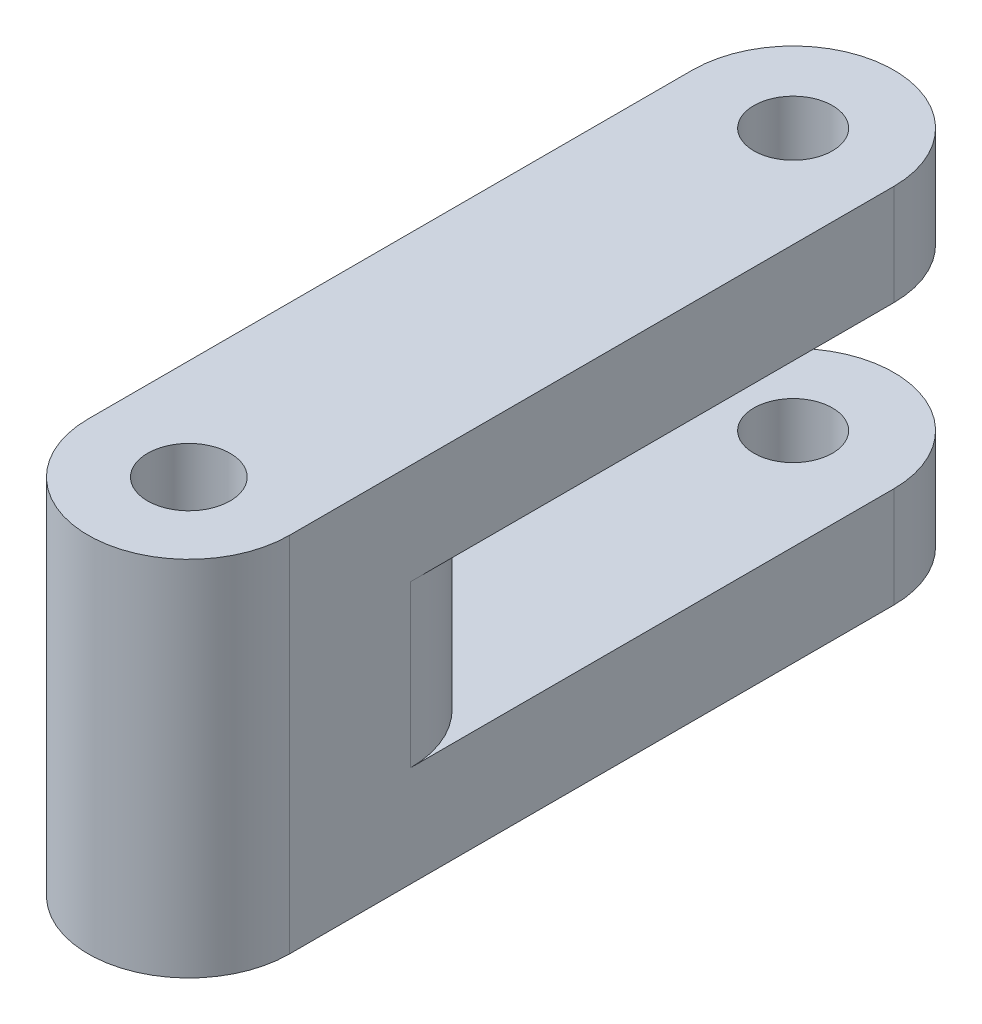
ISO-10303-21;
HEADER;
FILE_DESCRIPTION(('STEP AP214'),'2;1');
FILE_NAME('part.step','',(''),(''),'','','');
FILE_SCHEMA(('AUTOMOTIVE_DESIGN { 1 0 10303 214 1 1 1 1 }'));
ENDSEC;
DATA;
#1=APPLICATION_CONTEXT('core data for automotive mechanical design processes');
#2=APPLICATION_PROTOCOL_DEFINITION('international standard','automotive_design',2000,#1);
#3=PRODUCT_CONTEXT('',#1,'mechanical');
#4=PRODUCT('Part','Part','',(#3));
#5=PRODUCT_RELATED_PRODUCT_CATEGORY('part','',(#4));
#6=PRODUCT_DEFINITION_FORMATION('','',#4);
#7=PRODUCT_DEFINITION_CONTEXT('part definition',#1,'design');
#8=PRODUCT_DEFINITION('design','',#6,#7);
#9=PRODUCT_DEFINITION_SHAPE('','',#8);
#10=(LENGTH_UNIT() NAMED_UNIT(*) SI_UNIT(.MILLI.,.METRE.));
#11=(NAMED_UNIT(*) PLANE_ANGLE_UNIT() SI_UNIT($,.RADIAN.));
#12=(NAMED_UNIT(*) SI_UNIT($,.STERADIAN.) SOLID_ANGLE_UNIT());
#13=UNCERTAINTY_MEASURE_WITH_UNIT(LENGTH_MEASURE(1.E-05),#10,'distance_accuracy_value','');
#14=(GEOMETRIC_REPRESENTATION_CONTEXT(3) GLOBAL_UNCERTAINTY_ASSIGNED_CONTEXT((#13)) GLOBAL_UNIT_ASSIGNED_CONTEXT((#10,
#11,#12)) REPRESENTATION_CONTEXT('',''));
#15=CARTESIAN_POINT('',(0.,0.,0.));
#16=DIRECTION('',(0.,0.,1.));
#17=DIRECTION('',(1.,0.,0.));
#18=AXIS2_PLACEMENT_3D('',#15,#16,#17);
#19=CARTESIAN_POINT('',(0.,5.,0.));
#20=DIRECTION('',(0.,1.,0.));
#21=DIRECTION('',(0.,0.,1.));
#22=AXIS2_PLACEMENT_3D('',#19,#20,#21);
#23=PLANE('',#22);
#24=CARTESIAN_POINT('',(0.,5.,-6.));
#25=DIRECTION('',(0.,1.,0.));
#26=DIRECTION('',(0.,0.,1.));
#27=AXIS2_PLACEMENT_3D('',#24,#25,#26);
#28=CIRCLE('',#27,5.);
#29=CARTESIAN_POINT('',(5.,5.,-6.));
#30=VERTEX_POINT('',#29);
#31=CARTESIAN_POINT('',(-5.,5.,-6.));
#32=VERTEX_POINT('',#31);
#33=EDGE_CURVE('E78',#30,#32,#28,.T.);
#34=ORIENTED_EDGE('',*,*,#33,.F.);
#35=DIRECTION('',(0.,0.,-1.));
#36=VECTOR('',#35,1.);
#37=CARTESIAN_POINT('',(5.,5.,0.));
#38=LINE('',#37,#36);
#39=CARTESIAN_POINT('',(5.,5.,-30.));
#40=VERTEX_POINT('',#39);
#41=EDGE_CURVE('E116',#30,#40,#38,.T.);
#42=ORIENTED_EDGE('',*,*,#41,.T.);
#43=CARTESIAN_POINT('',(0.,5.,-30.));
#44=DIRECTION('',(0.,1.,0.));
#45=DIRECTION('',(0.,0.,1.));
#46=AXIS2_PLACEMENT_3D('',#43,#44,#45);
#47=CIRCLE('',#46,5.);
#48=CARTESIAN_POINT('',(-5.,5.,-30.));
#49=VERTEX_POINT('',#48);
#50=EDGE_CURVE('E84',#40,#49,#47,.T.);
#51=ORIENTED_EDGE('',*,*,#50,.T.);
#52=DIRECTION('',(0.,0.,1.));
#53=VECTOR('',#52,1.);
#54=CARTESIAN_POINT('',(-5.,5.,0.));
#55=LINE('',#54,#53);
#56=EDGE_CURVE('E126',#49,#32,#55,.T.);
#57=ORIENTED_EDGE('',*,*,#56,.T.);
#58=EDGE_LOOP('',(#34,#42,#51,#57));
#59=FACE_BOUND('',#58,.T.);
#60=CARTESIAN_POINT('',(0.,5.,-30.));
#61=DIRECTION('',(0.,1.,0.));
#62=DIRECTION('',(0.,0.,1.));
#63=AXIS2_PLACEMENT_3D('',#60,#61,#62);
#64=CIRCLE('',#63,1.95);
#65=CARTESIAN_POINT('',(0.,5.,-28.05));
#66=VERTEX_POINT('',#65);
#67=EDGE_CURVE('E131',#66,#66,#64,.T.);
#68=ORIENTED_EDGE('',*,*,#67,.F.);
#69=EDGE_LOOP('',(#68));
#70=FACE_BOUND('',#69,.T.);
#71=ADVANCED_FACE('F63',(#59,#70),#23,.T.);
#72=CARTESIAN_POINT('',(0.,0.,0.));
#73=DIRECTION('',(0.,1.,0.));
#74=DIRECTION('',(0.,0.,1.));
#75=AXIS2_PLACEMENT_3D('',#72,#73,#74);
#76=PLANE('',#75);
#77=CARTESIAN_POINT('',(0.,0.,0.));
#78=DIRECTION('',(0.,1.,0.));
#79=DIRECTION('',(0.,0.,1.));
#80=AXIS2_PLACEMENT_3D('',#77,#78,#79);
#81=CIRCLE('',#80,5.);
#82=CARTESIAN_POINT('',(-5.,0.,0.));
#83=VERTEX_POINT('',#82);
#84=CARTESIAN_POINT('',(5.,0.,0.));
#85=VERTEX_POINT('',#84);
#86=EDGE_CURVE('E122',#83,#85,#81,.T.);
#87=ORIENTED_EDGE('',*,*,#86,.F.);
#88=DIRECTION('',(0.,0.,1.));
#89=VECTOR('',#88,1.);
#90=CARTESIAN_POINT('',(-5.,0.,0.));
#91=LINE('',#90,#89);
#92=CARTESIAN_POINT('',(-5.,0.,-30.));
#93=VERTEX_POINT('',#92);
#94=EDGE_CURVE('E104',#93,#83,#91,.T.);
#95=ORIENTED_EDGE('',*,*,#94,.F.);
#96=CARTESIAN_POINT('',(0.,0.,-30.));
#97=DIRECTION('',(0.,1.,0.));
#98=DIRECTION('',(0.,0.,1.));
#99=AXIS2_PLACEMENT_3D('',#96,#97,#98);
#100=CIRCLE('',#99,5.);
#101=CARTESIAN_POINT('',(5.,0.,-30.));
#102=VERTEX_POINT('',#101);
#103=EDGE_CURVE('E117',#102,#93,#100,.T.);
#104=ORIENTED_EDGE('',*,*,#103,.F.);
#105=DIRECTION('',(0.,0.,-1.));
#106=VECTOR('',#105,1.);
#107=CARTESIAN_POINT('',(5.,0.,0.));
#108=LINE('',#107,#106);
#109=EDGE_CURVE('E130',#85,#102,#108,.T.);
#110=ORIENTED_EDGE('',*,*,#109,.F.);
#111=EDGE_LOOP('',(#87,#95,#104,#110));
#112=FACE_BOUND('',#111,.T.);
#113=CARTESIAN_POINT('',(0.,0.,-30.));
#114=DIRECTION('',(0.,1.,0.));
#115=DIRECTION('',(0.,0.,1.));
#116=AXIS2_PLACEMENT_3D('',#113,#114,#115);
#117=CIRCLE('',#116,1.95);
#118=CARTESIAN_POINT('',(0.,0.,-28.05));
#119=VERTEX_POINT('',#118);
#120=EDGE_CURVE('E135',#119,#119,#117,.T.);
#121=ORIENTED_EDGE('',*,*,#120,.T.);
#122=EDGE_LOOP('',(#121));
#123=FACE_BOUND('',#122,.T.);
#124=CARTESIAN_POINT('',(0.,0.,0.));
#125=DIRECTION('',(0.,1.,0.));
#126=DIRECTION('',(0.,0.,1.));
#127=AXIS2_PLACEMENT_3D('',#124,#125,#126);
#128=CIRCLE('',#127,2.05);
#129=CARTESIAN_POINT('',(0.,0.,2.05));
#130=VERTEX_POINT('',#129);
#131=EDGE_CURVE('E192',#130,#130,#128,.T.);
#132=ORIENTED_EDGE('',*,*,#131,.T.);
#133=EDGE_LOOP('',(#132));
#134=FACE_BOUND('',#133,.T.);
#135=ADVANCED_FACE('F128',(#112,#123,#134),#76,.F.);
#136=CARTESIAN_POINT('',(0.,5.,0.));
#137=DIRECTION('',(0.,-1.,0.));
#138=DIRECTION('',(0.,0.,-1.));
#139=AXIS2_PLACEMENT_3D('',#136,#137,#138);
#140=CYLINDRICAL_SURFACE('',#139,5.);
#141=ORIENTED_EDGE('',*,*,#86,.T.);
#142=DIRECTION('',(0.,-1.,0.));
#143=VECTOR('',#142,1.);
#144=CARTESIAN_POINT('',(5.,5.,0.));
#145=LINE('',#144,#143);
#146=CARTESIAN_POINT('',(5.,18.,0.));
#147=VERTEX_POINT('',#146);
#148=EDGE_CURVE('E12',#147,#85,#145,.T.);
#149=ORIENTED_EDGE('',*,*,#148,.F.);
#150=CARTESIAN_POINT('',(0.,18.,0.));
#151=DIRECTION('',(0.,1.,0.));
#152=DIRECTION('',(0.,0.,1.));
#153=AXIS2_PLACEMENT_3D('',#150,#151,#152);
#154=CIRCLE('',#153,5.);
#155=CARTESIAN_POINT('',(-5.,18.,0.));
#156=VERTEX_POINT('',#155);
#157=EDGE_CURVE('E124',#156,#147,#154,.T.);
#158=ORIENTED_EDGE('',*,*,#157,.F.);
#159=DIRECTION('',(0.,-1.,0.));
#160=VECTOR('',#159,1.);
#161=CARTESIAN_POINT('',(-5.,5.,0.));
#162=LINE('',#161,#160);
#163=EDGE_CURVE('E109',#156,#83,#162,.T.);
#164=ORIENTED_EDGE('',*,*,#163,.T.);
#165=EDGE_LOOP('',(#141,#149,#158,#164));
#166=FACE_BOUND('',#165,.T.);
#167=ADVANCED_FACE('F65',(#166),#140,.T.);
#168=CARTESIAN_POINT('',(5.,5.,0.));
#169=DIRECTION('',(-1.,0.,0.));
#170=DIRECTION('',(0.,0.,1.));
#171=AXIS2_PLACEMENT_3D('',#168,#169,#170);
#172=PLANE('',#171);
#173=ORIENTED_EDGE('',*,*,#109,.T.);
#174=DIRECTION('',(0.,-1.,0.));
#175=VECTOR('',#174,1.);
#176=CARTESIAN_POINT('',(5.,5.,-30.));
#177=LINE('',#176,#175);
#178=EDGE_CURVE('E71',#40,#102,#177,.T.);
#179=ORIENTED_EDGE('',*,*,#178,.F.);
#180=ORIENTED_EDGE('',*,*,#41,.F.);
#181=DIRECTION('',(0.,-1.,0.));
#182=VECTOR('',#181,1.);
#183=CARTESIAN_POINT('',(5.,13.,-6.));
#184=LINE('',#183,#182);
#185=CARTESIAN_POINT('',(5.,13.,-6.));
#186=VERTEX_POINT('',#185);
#187=EDGE_CURVE('E190',#186,#30,#184,.T.);
#188=ORIENTED_EDGE('',*,*,#187,.F.);
#189=DIRECTION('',(0.,0.,1.));
#190=VECTOR('',#189,1.);
#191=CARTESIAN_POINT('',(5.,13.,0.));
#192=LINE('',#191,#190);
#193=CARTESIAN_POINT('',(5.,13.,-30.));
#194=VERTEX_POINT('',#193);
#195=EDGE_CURVE('E175',#194,#186,#192,.T.);
#196=ORIENTED_EDGE('',*,*,#195,.F.);
#197=DIRECTION('',(0.,-1.,0.));
#198=VECTOR('',#197,1.);
#199=CARTESIAN_POINT('',(5.,18.,-30.));
#200=LINE('',#199,#198);
#201=CARTESIAN_POINT('',(5.,18.,-30.));
#202=VERTEX_POINT('',#201);
#203=EDGE_CURVE('E162',#202,#194,#200,.T.);
#204=ORIENTED_EDGE('',*,*,#203,.F.);
#205=DIRECTION('',(0.,0.,1.));
#206=VECTOR('',#205,1.);
#207=CARTESIAN_POINT('',(5.,18.,0.));
#208=LINE('',#207,#206);
#209=EDGE_CURVE('E153',#202,#147,#208,.T.);
#210=ORIENTED_EDGE('',*,*,#209,.T.);
#211=ORIENTED_EDGE('',*,*,#148,.T.);
#212=EDGE_LOOP('',(#173,#179,#180,#188,#196,#204,#210,#211));
#213=FACE_BOUND('',#212,.T.);
#214=ADVANCED_FACE('F146',(#213),#172,.F.);
#215=CARTESIAN_POINT('',(0.,5.,-30.));
#216=DIRECTION('',(0.,-1.,0.));
#217=DIRECTION('',(0.,0.,-1.));
#218=AXIS2_PLACEMENT_3D('',#215,#216,#217);
#219=CYLINDRICAL_SURFACE('',#218,5.);
#220=ORIENTED_EDGE('',*,*,#103,.T.);
#221=DIRECTION('',(0.,-1.,0.));
#222=VECTOR('',#221,1.);
#223=CARTESIAN_POINT('',(-5.,5.,-30.));
#224=LINE('',#223,#222);
#225=EDGE_CURVE('E112',#49,#93,#224,.T.);
#226=ORIENTED_EDGE('',*,*,#225,.F.);
#227=ORIENTED_EDGE('',*,*,#50,.F.);
#228=ORIENTED_EDGE('',*,*,#178,.T.);
#229=EDGE_LOOP('',(#220,#226,#227,#228));
#230=FACE_BOUND('',#229,.T.);
#231=ADVANCED_FACE('F144',(#230),#219,.T.);
#232=CARTESIAN_POINT('',(-5.,5.,0.));
#233=DIRECTION('',(1.,0.,0.));
#234=DIRECTION('',(0.,0.,-1.));
#235=AXIS2_PLACEMENT_3D('',#232,#233,#234);
#236=PLANE('',#235);
#237=ORIENTED_EDGE('',*,*,#94,.T.);
#238=ORIENTED_EDGE('',*,*,#163,.F.);
#239=DIRECTION('',(0.,0.,-1.));
#240=VECTOR('',#239,1.);
#241=CARTESIAN_POINT('',(-5.,18.,0.));
#242=LINE('',#241,#240);
#243=CARTESIAN_POINT('',(-5.,18.,-30.));
#244=VERTEX_POINT('',#243);
#245=EDGE_CURVE('E160',#156,#244,#242,.T.);
#246=ORIENTED_EDGE('',*,*,#245,.T.);
#247=DIRECTION('',(0.,-1.,0.));
#248=VECTOR('',#247,1.);
#249=CARTESIAN_POINT('',(-5.,18.,-30.));
#250=LINE('',#249,#248);
#251=CARTESIAN_POINT('',(-5.,13.,-30.));
#252=VERTEX_POINT('',#251);
#253=EDGE_CURVE('E180',#244,#252,#250,.T.);
#254=ORIENTED_EDGE('',*,*,#253,.T.);
#255=DIRECTION('',(0.,0.,-1.));
#256=VECTOR('',#255,1.);
#257=CARTESIAN_POINT('',(-5.,13.,0.));
#258=LINE('',#257,#256);
#259=CARTESIAN_POINT('',(-5.,13.,-6.));
#260=VERTEX_POINT('',#259);
#261=EDGE_CURVE('E171',#260,#252,#258,.T.);
#262=ORIENTED_EDGE('',*,*,#261,.F.);
#263=DIRECTION('',(0.,-1.,0.));
#264=VECTOR('',#263,1.);
#265=CARTESIAN_POINT('',(-5.,13.,-6.));
#266=LINE('',#265,#264);
#267=EDGE_CURVE('E186',#260,#32,#266,.T.);
#268=ORIENTED_EDGE('',*,*,#267,.T.);
#269=ORIENTED_EDGE('',*,*,#56,.F.);
#270=ORIENTED_EDGE('',*,*,#225,.T.);
#271=EDGE_LOOP('',(#237,#238,#246,#254,#262,#268,#269,#270));
#272=FACE_BOUND('',#271,.T.);
#273=ADVANCED_FACE('F106',(#272),#236,.F.);
#274=CARTESIAN_POINT('',(0.,5.,-30.));
#275=DIRECTION('',(0.,-1.,0.));
#276=DIRECTION('',(0.,0.,-1.));
#277=AXIS2_PLACEMENT_3D('',#274,#275,#276);
#278=CYLINDRICAL_SURFACE('',#277,1.95);
#279=ORIENTED_EDGE('',*,*,#67,.T.);
#280=EDGE_LOOP('',(#279));
#281=FACE_BOUND('',#280,.T.);
#282=ORIENTED_EDGE('',*,*,#120,.F.);
#283=EDGE_LOOP('',(#282));
#284=FACE_BOUND('',#283,.T.);
#285=ADVANCED_FACE('F253',(#281,#284),#278,.F.);
#286=CARTESIAN_POINT('',(0.,5.,0.));
#287=DIRECTION('',(0.,-1.,0.));
#288=DIRECTION('',(0.,0.,-1.));
#289=AXIS2_PLACEMENT_3D('',#286,#287,#288);
#290=CYLINDRICAL_SURFACE('',#289,2.05);
#291=ORIENTED_EDGE('',*,*,#131,.F.);
#292=EDGE_LOOP('',(#291));
#293=FACE_BOUND('',#292,.T.);
#294=CARTESIAN_POINT('',(0.,18.,0.));
#295=DIRECTION('',(0.,1.,0.));
#296=DIRECTION('',(0.,0.,1.));
#297=AXIS2_PLACEMENT_3D('',#294,#295,#296);
#298=CIRCLE('',#297,2.05);
#299=CARTESIAN_POINT('',(0.,18.,2.05));
#300=VERTEX_POINT('',#299);
#301=EDGE_CURVE('E172',#300,#300,#298,.T.);
#302=ORIENTED_EDGE('',*,*,#301,.T.);
#303=EDGE_LOOP('',(#302));
#304=FACE_BOUND('',#303,.T.);
#305=ADVANCED_FACE('F242',(#293,#304),#290,.F.);
#306=CARTESIAN_POINT('',(0.,13.,-6.));
#307=DIRECTION('',(0.,-1.,0.));
#308=DIRECTION('',(0.,0.,-1.));
#309=AXIS2_PLACEMENT_3D('',#306,#307,#308);
#310=CYLINDRICAL_SURFACE('',#309,5.);
#311=ORIENTED_EDGE('',*,*,#33,.T.);
#312=ORIENTED_EDGE('',*,*,#267,.F.);
#313=CARTESIAN_POINT('',(0.,13.,-6.));
#314=DIRECTION('',(0.,1.,0.));
#315=DIRECTION('',(0.,0.,1.));
#316=AXIS2_PLACEMENT_3D('',#313,#314,#315);
#317=CIRCLE('',#316,5.);
#318=EDGE_CURVE('E183',#186,#260,#317,.T.);
#319=ORIENTED_EDGE('',*,*,#318,.F.);
#320=ORIENTED_EDGE('',*,*,#187,.T.);
#321=EDGE_LOOP('',(#311,#312,#319,#320));
#322=FACE_BOUND('',#321,.T.);
#323=ADVANCED_FACE('F202',(#322),#310,.T.);
#324=CARTESIAN_POINT('',(0.,18.,-30.));
#325=DIRECTION('',(0.,1.,0.));
#326=DIRECTION('',(0.,0.,1.));
#327=AXIS2_PLACEMENT_3D('',#324,#325,#326);
#328=PLANE('',#327);
#329=ORIENTED_EDGE('',*,*,#301,.F.);
#330=EDGE_LOOP('',(#329));
#331=FACE_BOUND('',#330,.T.);
#332=CARTESIAN_POINT('',(0.,18.,-30.));
#333=DIRECTION('',(0.,1.,0.));
#334=DIRECTION('',(0.,0.,1.));
#335=AXIS2_PLACEMENT_3D('',#332,#333,#334);
#336=CIRCLE('',#335,5.);
#337=EDGE_CURVE('E164',#202,#244,#336,.T.);
#338=ORIENTED_EDGE('',*,*,#337,.T.);
#339=ORIENTED_EDGE('',*,*,#245,.F.);
#340=ORIENTED_EDGE('',*,*,#157,.T.);
#341=ORIENTED_EDGE('',*,*,#209,.F.);
#342=EDGE_LOOP('',(#338,#339,#340,#341));
#343=FACE_BOUND('',#342,.T.);
#344=CARTESIAN_POINT('',(0.,18.,-30.));
#345=DIRECTION('',(0.,1.,0.));
#346=DIRECTION('',(0.,0.,1.));
#347=AXIS2_PLACEMENT_3D('',#344,#345,#346);
#348=CIRCLE('',#347,1.95);
#349=CARTESIAN_POINT('',(0.,18.,-28.05));
#350=VERTEX_POINT('',#349);
#351=EDGE_CURVE('E225',#350,#350,#348,.T.);
#352=ORIENTED_EDGE('',*,*,#351,.F.);
#353=EDGE_LOOP('',(#352));
#354=FACE_BOUND('',#353,.T.);
#355=ADVANCED_FACE('F158',(#331,#343,#354),#328,.T.);
#356=CARTESIAN_POINT('',(0.,13.,-30.));
#357=DIRECTION('',(0.,1.,0.));
#358=DIRECTION('',(0.,0.,1.));
#359=AXIS2_PLACEMENT_3D('',#356,#357,#358);
#360=PLANE('',#359);
#361=ORIENTED_EDGE('',*,*,#195,.T.);
#362=ORIENTED_EDGE('',*,*,#318,.T.);
#363=ORIENTED_EDGE('',*,*,#261,.T.);
#364=CARTESIAN_POINT('',(0.,13.,-30.));
#365=DIRECTION('',(0.,1.,0.));
#366=DIRECTION('',(0.,0.,1.));
#367=AXIS2_PLACEMENT_3D('',#364,#365,#366);
#368=CIRCLE('',#367,5.);
#369=EDGE_CURVE('E168',#194,#252,#368,.T.);
#370=ORIENTED_EDGE('',*,*,#369,.F.);
#371=EDGE_LOOP('',(#361,#362,#363,#370));
#372=FACE_BOUND('',#371,.T.);
#373=CARTESIAN_POINT('',(0.,13.,-30.));
#374=DIRECTION('',(0.,1.,0.));
#375=DIRECTION('',(0.,0.,1.));
#376=AXIS2_PLACEMENT_3D('',#373,#374,#375);
#377=CIRCLE('',#376,1.95);
#378=CARTESIAN_POINT('',(0.,13.,-28.05));
#379=VERTEX_POINT('',#378);
#380=EDGE_CURVE('E226',#379,#379,#377,.T.);
#381=ORIENTED_EDGE('',*,*,#380,.T.);
#382=EDGE_LOOP('',(#381));
#383=FACE_BOUND('',#382,.T.);
#384=ADVANCED_FACE('F210',(#372,#383),#360,.F.);
#385=CARTESIAN_POINT('',(0.,18.,-30.));
#386=DIRECTION('',(0.,-1.,0.));
#387=DIRECTION('',(0.,0.,-1.));
#388=AXIS2_PLACEMENT_3D('',#385,#386,#387);
#389=CYLINDRICAL_SURFACE('',#388,5.);
#390=ORIENTED_EDGE('',*,*,#369,.T.);
#391=ORIENTED_EDGE('',*,*,#253,.F.);
#392=ORIENTED_EDGE('',*,*,#337,.F.);
#393=ORIENTED_EDGE('',*,*,#203,.T.);
#394=EDGE_LOOP('',(#390,#391,#392,#393));
#395=FACE_BOUND('',#394,.T.);
#396=ADVANCED_FACE('F221',(#395),#389,.T.);
#397=CARTESIAN_POINT('',(0.,18.,-30.));
#398=DIRECTION('',(0.,-1.,0.));
#399=DIRECTION('',(0.,0.,-1.));
#400=AXIS2_PLACEMENT_3D('',#397,#398,#399);
#401=CYLINDRICAL_SURFACE('',#400,1.95);
#402=ORIENTED_EDGE('',*,*,#351,.T.);
#403=EDGE_LOOP('',(#402));
#404=FACE_BOUND('',#403,.T.);
#405=ORIENTED_EDGE('',*,*,#380,.F.);
#406=EDGE_LOOP('',(#405));
#407=FACE_BOUND('',#406,.T.);
#408=ADVANCED_FACE('F232',(#404,#407),#401,.F.);
#409=CLOSED_SHELL('',(#71,#135,#167,#214,#231,#273,#285,#305,#323,#355,#384,#396,#408));
#410=MANIFOLD_SOLID_BREP('B2',#409);
#411=ADVANCED_BREP_SHAPE_REPRESENTATION('',(#18,#410),#14);
#412=SHAPE_DEFINITION_REPRESENTATION(#9,#411);
ENDSEC;
END-ISO-10303-21;
